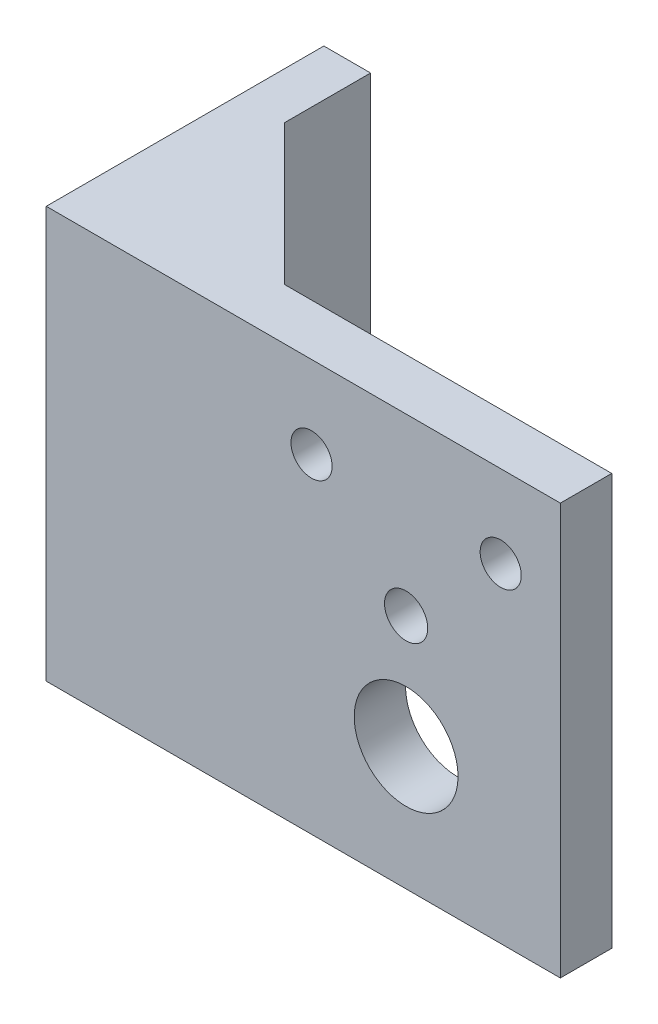
ISO-10303-21;
HEADER;
FILE_DESCRIPTION(('STEP AP214'),'2;1');
FILE_NAME('part.step','',(''),(''),'','','');
FILE_SCHEMA(('AUTOMOTIVE_DESIGN { 1 0 10303 214 1 1 1 1 }'));
ENDSEC;
DATA;
#1=APPLICATION_CONTEXT('core data for automotive mechanical design processes');
#2=APPLICATION_PROTOCOL_DEFINITION('international standard','automotive_design',2000,#1);
#3=PRODUCT_CONTEXT('',#1,'mechanical');
#4=PRODUCT('Part','Part','',(#3));
#5=PRODUCT_RELATED_PRODUCT_CATEGORY('part','',(#4));
#6=PRODUCT_DEFINITION_FORMATION('','',#4);
#7=PRODUCT_DEFINITION_CONTEXT('part definition',#1,'design');
#8=PRODUCT_DEFINITION('design','',#6,#7);
#9=PRODUCT_DEFINITION_SHAPE('','',#8);
#10=(LENGTH_UNIT() NAMED_UNIT(*) SI_UNIT(.MILLI.,.METRE.));
#11=(NAMED_UNIT(*) PLANE_ANGLE_UNIT() SI_UNIT($,.RADIAN.));
#12=(NAMED_UNIT(*) SI_UNIT($,.STERADIAN.) SOLID_ANGLE_UNIT());
#13=UNCERTAINTY_MEASURE_WITH_UNIT(LENGTH_MEASURE(1.E-05),#10,'distance_accuracy_value','');
#14=(GEOMETRIC_REPRESENTATION_CONTEXT(3) GLOBAL_UNCERTAINTY_ASSIGNED_CONTEXT((#13)) GLOBAL_UNIT_ASSIGNED_CONTEXT((#10,
#11,#12)) REPRESENTATION_CONTEXT('',''));
#15=CARTESIAN_POINT('',(0.,0.,0.));
#16=DIRECTION('',(0.,0.,1.));
#17=DIRECTION('',(1.,0.,0.));
#18=AXIS2_PLACEMENT_3D('',#15,#16,#17);
#19=CARTESIAN_POINT('',(50.,40.,-5.));
#20=DIRECTION('',(0.,0.,1.));
#21=DIRECTION('',(1.,0.,0.));
#22=AXIS2_PLACEMENT_3D('',#19,#20,#21);
#23=PLANE('',#22);
#24=CARTESIAN_POINT('',(35.,12.,-5.));
#25=DIRECTION('',(0.,0.,1.));
#26=DIRECTION('',(1.,0.,0.));
#27=AXIS2_PLACEMENT_3D('',#24,#25,#26);
#28=CIRCLE('',#27,5.05);
#29=CARTESIAN_POINT('',(40.05,12.,-5.));
#30=VERTEX_POINT('',#29);
#31=EDGE_CURVE('E220',#30,#30,#28,.T.);
#32=ORIENTED_EDGE('',*,*,#31,.T.);
#33=EDGE_LOOP('',(#32));
#34=FACE_BOUND('',#33,.T.);
#35=CARTESIAN_POINT('',(35.,23.,-5.));
#36=DIRECTION('',(0.,0.,-1.));
#37=DIRECTION('',(-1.,0.,0.));
#38=AXIS2_PLACEMENT_3D('',#35,#36,#37);
#39=CIRCLE('',#38,2.1);
#40=CARTESIAN_POINT('',(32.9,23.,-5.));
#41=VERTEX_POINT('',#40);
#42=EDGE_CURVE('E229',#41,#41,#39,.T.);
#43=ORIENTED_EDGE('',*,*,#42,.F.);
#44=EDGE_LOOP('',(#43));
#45=FACE_BOUND('',#44,.T.);
#46=CARTESIAN_POINT('',(25.8,32.,-5.));
#47=DIRECTION('',(0.,0.,-1.));
#48=DIRECTION('',(-1.,0.,0.));
#49=AXIS2_PLACEMENT_3D('',#46,#47,#48);
#50=CIRCLE('',#49,2.);
#51=CARTESIAN_POINT('',(23.8,32.,-5.));
#52=VERTEX_POINT('',#51);
#53=EDGE_CURVE('E223',#52,#52,#50,.T.);
#54=ORIENTED_EDGE('',*,*,#53,.F.);
#55=EDGE_LOOP('',(#54));
#56=FACE_BOUND('',#55,.T.);
#57=CARTESIAN_POINT('',(44.2,32.,-5.));
#58=DIRECTION('',(0.,0.,-1.));
#59=DIRECTION('',(-1.,0.,0.));
#60=AXIS2_PLACEMENT_3D('',#57,#58,#59);
#61=CIRCLE('',#60,2.);
#62=CARTESIAN_POINT('',(42.2,32.,-5.));
#63=VERTEX_POINT('',#62);
#64=EDGE_CURVE('E216',#63,#63,#61,.T.);
#65=ORIENTED_EDGE('',*,*,#64,.F.);
#66=EDGE_LOOP('',(#65));
#67=FACE_BOUND('',#66,.T.);
#68=DIRECTION('',(0.,-1.,0.));
#69=VECTOR('',#68,1.);
#70=CARTESIAN_POINT('',(20.,5.,-5.));
#71=LINE('',#70,#69);
#72=CARTESIAN_POINT('',(20.,5.,-5.));
#73=VERTEX_POINT('',#72);
#74=CARTESIAN_POINT('',(20.,0.,-5.));
#75=VERTEX_POINT('',#74);
#76=EDGE_CURVE('E58',#73,#75,#71,.T.);
#77=ORIENTED_EDGE('',*,*,#76,.F.);
#78=DIRECTION('',(1.,0.,0.));
#79=VECTOR('',#78,1.);
#80=CARTESIAN_POINT('',(4.54545454545454,5.,-5.));
#81=LINE('',#80,#79);
#82=CARTESIAN_POINT('',(4.54545454545454,5.,-5.));
#83=VERTEX_POINT('',#82);
#84=EDGE_CURVE('E189',#83,#73,#81,.T.);
#85=ORIENTED_EDGE('',*,*,#84,.F.);
#86=DIRECTION('',(0.,-1.,0.));
#87=VECTOR('',#86,1.);
#88=CARTESIAN_POINT('',(4.54545454545454,35.,-5.));
#89=LINE('',#88,#87);
#90=CARTESIAN_POINT('',(4.54545454545454,35.,-5.));
#91=VERTEX_POINT('',#90);
#92=EDGE_CURVE('E163',#91,#83,#89,.T.);
#93=ORIENTED_EDGE('',*,*,#92,.F.);
#94=DIRECTION('',(1.,0.,0.));
#95=VECTOR('',#94,1.);
#96=CARTESIAN_POINT('',(4.54545454545454,35.,-5.));
#97=LINE('',#96,#95);
#98=CARTESIAN_POINT('',(18.1818181818182,35.,-5.));
#99=VERTEX_POINT('',#98);
#100=EDGE_CURVE('E178',#91,#99,#97,.T.);
#101=ORIENTED_EDGE('',*,*,#100,.T.);
#102=DIRECTION('',(0.,-1.,0.));
#103=VECTOR('',#102,1.);
#104=CARTESIAN_POINT('',(18.1818181818182,40.,-5.));
#105=LINE('',#104,#103);
#106=CARTESIAN_POINT('',(18.1818181818182,40.,-5.));
#107=VERTEX_POINT('',#106);
#108=EDGE_CURVE('E147',#107,#99,#105,.T.);
#109=ORIENTED_EDGE('',*,*,#108,.F.);
#110=DIRECTION('',(-1.,0.,0.));
#111=VECTOR('',#110,1.);
#112=CARTESIAN_POINT('',(50.,40.,-5.));
#113=LINE('',#112,#111);
#114=CARTESIAN_POINT('',(50.,40.,-5.));
#115=VERTEX_POINT('',#114);
#116=EDGE_CURVE('E155',#115,#107,#113,.T.);
#117=ORIENTED_EDGE('',*,*,#116,.F.);
#118=DIRECTION('',(0.,-1.,0.));
#119=VECTOR('',#118,1.);
#120=CARTESIAN_POINT('',(50.,40.,-5.));
#121=LINE('',#120,#119);
#122=CARTESIAN_POINT('',(50.,0.,-5.));
#123=VERTEX_POINT('',#122);
#124=EDGE_CURVE('E43',#115,#123,#121,.T.);
#125=ORIENTED_EDGE('',*,*,#124,.T.);
#126=DIRECTION('',(-1.,0.,0.));
#127=VECTOR('',#126,1.);
#128=CARTESIAN_POINT('',(50.,0.,-5.));
#129=LINE('',#128,#127);
#130=EDGE_CURVE('E138',#123,#75,#129,.T.);
#131=ORIENTED_EDGE('',*,*,#130,.T.);
#132=EDGE_LOOP('',(#77,#85,#93,#101,#109,#117,#125,#131));
#133=FACE_BOUND('',#132,.T.);
#134=ADVANCED_FACE('F35',(#34,#45,#56,#67,#133),#23,.F.);
#135=CARTESIAN_POINT('',(4.54545454545454,40.,-18.6363636363636));
#136=DIRECTION('',(-1.,0.,0.));
#137=DIRECTION('',(0.,0.,1.));
#138=AXIS2_PLACEMENT_3D('',#135,#136,#137);
#139=PLANE('',#138);
#140=CARTESIAN_POINT('',(4.54545454545454,20.,-21.));
#141=DIRECTION('',(1.,0.,0.));
#142=DIRECTION('',(0.,0.,-1.));
#143=AXIS2_PLACEMENT_3D('',#140,#141,#142);
#144=CIRCLE('',#143,2.);
#145=CARTESIAN_POINT('',(4.54545454545454,20.,-23.));
#146=VERTEX_POINT('',#145);
#147=EDGE_CURVE('E211',#146,#146,#144,.T.);
#148=ORIENTED_EDGE('',*,*,#147,.F.);
#149=EDGE_LOOP('',(#148));
#150=FACE_BOUND('',#149,.T.);
#151=CARTESIAN_POINT('',(4.54545454545454,10.,-13.));
#152=DIRECTION('',(1.,0.,0.));
#153=DIRECTION('',(0.,0.,-1.));
#154=AXIS2_PLACEMENT_3D('',#151,#152,#153);
#155=CIRCLE('',#154,2.);
#156=CARTESIAN_POINT('',(4.54545454545454,10.,-15.));
#157=VERTEX_POINT('',#156);
#158=EDGE_CURVE('E205',#157,#157,#155,.T.);
#159=ORIENTED_EDGE('',*,*,#158,.F.);
#160=EDGE_LOOP('',(#159));
#161=FACE_BOUND('',#160,.T.);
#162=CARTESIAN_POINT('',(4.54545454545454,30.,-13.));
#163=DIRECTION('',(1.,0.,0.));
#164=DIRECTION('',(0.,0.,-1.));
#165=AXIS2_PLACEMENT_3D('',#162,#163,#164);
#166=CIRCLE('',#165,2.);
#167=CARTESIAN_POINT('',(4.54545454545454,30.,-15.));
#168=VERTEX_POINT('',#167);
#169=EDGE_CURVE('E198',#168,#168,#166,.T.);
#170=ORIENTED_EDGE('',*,*,#169,.F.);
#171=EDGE_LOOP('',(#170));
#172=FACE_BOUND('',#171,.T.);
#173=DIRECTION('',(0.,0.,-1.));
#174=VECTOR('',#173,1.);
#175=CARTESIAN_POINT('',(4.54545454545454,0.,-18.6363636363636));
#176=LINE('',#175,#174);
#177=CARTESIAN_POINT('',(4.54545454545454,0.,-20.));
#178=VERTEX_POINT('',#177);
#179=CARTESIAN_POINT('',(4.54545454545454,0.,-27.));
#180=VERTEX_POINT('',#179);
#181=EDGE_CURVE('E133',#178,#180,#176,.T.);
#182=ORIENTED_EDGE('',*,*,#181,.T.);
#183=DIRECTION('',(0.,-1.,0.));
#184=VECTOR('',#183,1.);
#185=CARTESIAN_POINT('',(4.54545454545454,40.,-27.));
#186=LINE('',#185,#184);
#187=CARTESIAN_POINT('',(4.54545454545454,40.,-27.));
#188=VERTEX_POINT('',#187);
#189=EDGE_CURVE('E113',#188,#180,#186,.T.);
#190=ORIENTED_EDGE('',*,*,#189,.F.);
#191=DIRECTION('',(0.,0.,-1.));
#192=VECTOR('',#191,1.);
#193=CARTESIAN_POINT('',(4.54545454545454,40.,-18.6363636363636));
#194=LINE('',#193,#192);
#195=CARTESIAN_POINT('',(4.54545454545454,40.,-18.6363636363636));
#196=VERTEX_POINT('',#195);
#197=EDGE_CURVE('E165',#196,#188,#194,.T.);
#198=ORIENTED_EDGE('',*,*,#197,.F.);
#199=DIRECTION('',(0.,-1.,0.));
#200=VECTOR('',#199,1.);
#201=CARTESIAN_POINT('',(4.54545454545454,40.,-18.6363636363636));
#202=LINE('',#201,#200);
#203=CARTESIAN_POINT('',(4.54545454545454,35.,-18.6363636363636));
#204=VERTEX_POINT('',#203);
#205=EDGE_CURVE('E144',#196,#204,#202,.T.);
#206=ORIENTED_EDGE('',*,*,#205,.T.);
#207=DIRECTION('',(0.,0.,1.));
#208=VECTOR('',#207,1.);
#209=CARTESIAN_POINT('',(4.54545454545454,35.,-18.6363636363636));
#210=LINE('',#209,#208);
#211=EDGE_CURVE('E180',#204,#91,#210,.T.);
#212=ORIENTED_EDGE('',*,*,#211,.T.);
#213=ORIENTED_EDGE('',*,*,#92,.T.);
#214=DIRECTION('',(0.,0.,1.));
#215=VECTOR('',#214,1.);
#216=CARTESIAN_POINT('',(4.54545454545454,5.,-20.));
#217=LINE('',#216,#215);
#218=CARTESIAN_POINT('',(4.54545454545454,5.,-20.));
#219=VERTEX_POINT('',#218);
#220=EDGE_CURVE('E187',#219,#83,#217,.T.);
#221=ORIENTED_EDGE('',*,*,#220,.F.);
#222=DIRECTION('',(0.,-1.,0.));
#223=VECTOR('',#222,1.);
#224=CARTESIAN_POINT('',(4.54545454545454,5.,-20.));
#225=LINE('',#224,#223);
#226=EDGE_CURVE('E184',#219,#178,#225,.T.);
#227=ORIENTED_EDGE('',*,*,#226,.T.);
#228=EDGE_LOOP('',(#182,#190,#198,#206,#212,#213,#221,#227));
#229=FACE_BOUND('',#228,.T.);
#230=ADVANCED_FACE('F242',(#150,#161,#172,#229),#139,.F.);
#231=CARTESIAN_POINT('',(0.,0.,0.));
#232=DIRECTION('',(0.,1.,0.));
#233=DIRECTION('',(0.,0.,1.));
#234=AXIS2_PLACEMENT_3D('',#231,#232,#233);
#235=PLANE('',#234);
#236=DIRECTION('',(0.,0.,1.));
#237=VECTOR('',#236,1.);
#238=CARTESIAN_POINT('',(0.,0.,-35.));
#239=LINE('',#238,#237);
#240=CARTESIAN_POINT('',(0.,0.,-27.));
#241=VERTEX_POINT('',#240);
#242=CARTESIAN_POINT('',(0.,0.,0.));
#243=VERTEX_POINT('',#242);
#244=EDGE_CURVE('E124',#241,#243,#239,.T.);
#245=ORIENTED_EDGE('',*,*,#244,.F.);
#246=DIRECTION('',(1.,0.,0.));
#247=VECTOR('',#246,1.);
#248=CARTESIAN_POINT('',(0.,0.,-27.));
#249=LINE('',#248,#247);
#250=EDGE_CURVE('E110',#241,#180,#249,.T.);
#251=ORIENTED_EDGE('',*,*,#250,.T.);
#252=ORIENTED_EDGE('',*,*,#181,.F.);
#253=DIRECTION('',(-0.717580691628316,0.,-0.69647537716866));
#254=VECTOR('',#253,1.);
#255=CARTESIAN_POINT('',(20.,0.,-5.));
#256=LINE('',#255,#254);
#257=EDGE_CURVE('E159',#75,#178,#256,.T.);
#258=ORIENTED_EDGE('',*,*,#257,.F.);
#259=ORIENTED_EDGE('',*,*,#130,.F.);
#260=DIRECTION('',(0.,0.,-1.));
#261=VECTOR('',#260,1.);
#262=CARTESIAN_POINT('',(50.,0.,0.));
#263=LINE('',#262,#261);
#264=CARTESIAN_POINT('',(50.,0.,0.));
#265=VERTEX_POINT('',#264);
#266=EDGE_CURVE('E157',#265,#123,#263,.T.);
#267=ORIENTED_EDGE('',*,*,#266,.F.);
#268=DIRECTION('',(1.,0.,0.));
#269=VECTOR('',#268,1.);
#270=CARTESIAN_POINT('',(0.,0.,0.));
#271=LINE('',#270,#269);
#272=EDGE_CURVE('E131',#243,#265,#271,.T.);
#273=ORIENTED_EDGE('',*,*,#272,.F.);
#274=EDGE_LOOP('',(#245,#251,#252,#258,#259,#267,#273));
#275=FACE_BOUND('',#274,.T.);
#276=ADVANCED_FACE('F129',(#275),#235,.F.);
#277=CARTESIAN_POINT('',(0.,40.,0.));
#278=DIRECTION('',(0.,0.,-1.));
#279=DIRECTION('',(-1.,0.,0.));
#280=AXIS2_PLACEMENT_3D('',#277,#278,#279);
#281=PLANE('',#280);
#282=CARTESIAN_POINT('',(35.,12.,0.));
#283=DIRECTION('',(0.,0.,1.));
#284=DIRECTION('',(1.,0.,0.));
#285=AXIS2_PLACEMENT_3D('',#282,#283,#284);
#286=CIRCLE('',#285,5.05);
#287=CARTESIAN_POINT('',(40.05,12.,0.));
#288=VERTEX_POINT('',#287);
#289=EDGE_CURVE('E117',#288,#288,#286,.T.);
#290=ORIENTED_EDGE('',*,*,#289,.F.);
#291=EDGE_LOOP('',(#290));
#292=FACE_BOUND('',#291,.T.);
#293=CARTESIAN_POINT('',(35.,23.,0.));
#294=DIRECTION('',(0.,0.,-1.));
#295=DIRECTION('',(-1.,0.,0.));
#296=AXIS2_PLACEMENT_3D('',#293,#294,#295);
#297=CIRCLE('',#296,2.1);
#298=CARTESIAN_POINT('',(32.9,23.,0.));
#299=VERTEX_POINT('',#298);
#300=EDGE_CURVE('E202',#299,#299,#297,.T.);
#301=ORIENTED_EDGE('',*,*,#300,.T.);
#302=EDGE_LOOP('',(#301));
#303=FACE_BOUND('',#302,.T.);
#304=CARTESIAN_POINT('',(25.8,32.,0.));
#305=DIRECTION('',(0.,0.,-1.));
#306=DIRECTION('',(-1.,0.,0.));
#307=AXIS2_PLACEMENT_3D('',#304,#305,#306);
#308=CIRCLE('',#307,2.);
#309=CARTESIAN_POINT('',(23.8,32.,0.));
#310=VERTEX_POINT('',#309);
#311=EDGE_CURVE('E226',#310,#310,#308,.T.);
#312=ORIENTED_EDGE('',*,*,#311,.T.);
#313=EDGE_LOOP('',(#312));
#314=FACE_BOUND('',#313,.T.);
#315=CARTESIAN_POINT('',(44.2,32.,0.));
#316=DIRECTION('',(0.,0.,-1.));
#317=DIRECTION('',(-1.,0.,0.));
#318=AXIS2_PLACEMENT_3D('',#315,#316,#317);
#319=CIRCLE('',#318,2.);
#320=CARTESIAN_POINT('',(42.2,32.,0.));
#321=VERTEX_POINT('',#320);
#322=EDGE_CURVE('E219',#321,#321,#319,.T.);
#323=ORIENTED_EDGE('',*,*,#322,.T.);
#324=EDGE_LOOP('',(#323));
#325=FACE_BOUND('',#324,.T.);
#326=ORIENTED_EDGE('',*,*,#272,.T.);
#327=DIRECTION('',(0.,-1.,0.));
#328=VECTOR('',#327,1.);
#329=CARTESIAN_POINT('',(50.,40.,0.));
#330=LINE('',#329,#328);
#331=CARTESIAN_POINT('',(50.,40.,0.));
#332=VERTEX_POINT('',#331);
#333=EDGE_CURVE('E11',#332,#265,#330,.T.);
#334=ORIENTED_EDGE('',*,*,#333,.F.);
#335=DIRECTION('',(1.,0.,0.));
#336=VECTOR('',#335,1.);
#337=CARTESIAN_POINT('',(0.,40.,0.));
#338=LINE('',#337,#336);
#339=CARTESIAN_POINT('',(0.,40.,0.));
#340=VERTEX_POINT('',#339);
#341=EDGE_CURVE('E132',#340,#332,#338,.T.);
#342=ORIENTED_EDGE('',*,*,#341,.F.);
#343=DIRECTION('',(0.,-1.,0.));
#344=VECTOR('',#343,1.);
#345=CARTESIAN_POINT('',(0.,40.,0.));
#346=LINE('',#345,#344);
#347=EDGE_CURVE('E142',#340,#243,#346,.T.);
#348=ORIENTED_EDGE('',*,*,#347,.T.);
#349=EDGE_LOOP('',(#326,#334,#342,#348));
#350=FACE_BOUND('',#349,.T.);
#351=ADVANCED_FACE('F37',(#292,#303,#314,#325,#350),#281,.F.);
#352=CARTESIAN_POINT('',(50.,40.,0.));
#353=DIRECTION('',(-1.,0.,0.));
#354=DIRECTION('',(0.,0.,1.));
#355=AXIS2_PLACEMENT_3D('',#352,#353,#354);
#356=PLANE('',#355);
#357=ORIENTED_EDGE('',*,*,#266,.T.);
#358=ORIENTED_EDGE('',*,*,#124,.F.);
#359=DIRECTION('',(0.,0.,-1.));
#360=VECTOR('',#359,1.);
#361=CARTESIAN_POINT('',(50.,40.,0.));
#362=LINE('',#361,#360);
#363=EDGE_CURVE('E136',#332,#115,#362,.T.);
#364=ORIENTED_EDGE('',*,*,#363,.F.);
#365=ORIENTED_EDGE('',*,*,#333,.T.);
#366=EDGE_LOOP('',(#357,#358,#364,#365));
#367=FACE_BOUND('',#366,.T.);
#368=ADVANCED_FACE('F275',(#367),#356,.F.);
#369=CARTESIAN_POINT('',(4.54545454545454,40.,-18.6363636363636));
#370=DIRECTION('',(0.707106781186547,0.,-0.707106781186548));
#371=DIRECTION('',(-0.707106781186548,0.,-0.707106781186547));
#372=AXIS2_PLACEMENT_3D('',#369,#370,#371);
#373=PLANE('',#372);
#374=DIRECTION('',(0.707106781186548,0.,0.707106781186547));
#375=VECTOR('',#374,1.);
#376=CARTESIAN_POINT('',(4.54545454545454,35.,-18.6363636363636));
#377=LINE('',#376,#375);
#378=EDGE_CURVE('E175',#204,#99,#377,.T.);
#379=ORIENTED_EDGE('',*,*,#378,.F.);
#380=ORIENTED_EDGE('',*,*,#205,.F.);
#381=DIRECTION('',(0.707106781186548,0.,0.707106781186547));
#382=VECTOR('',#381,1.);
#383=CARTESIAN_POINT('',(4.54545454545454,40.,-18.6363636363636));
#384=LINE('',#383,#382);
#385=EDGE_CURVE('E168',#196,#107,#384,.T.);
#386=ORIENTED_EDGE('',*,*,#385,.T.);
#387=ORIENTED_EDGE('',*,*,#108,.T.);
#388=EDGE_LOOP('',(#379,#380,#386,#387));
#389=FACE_BOUND('',#388,.T.);
#390=ADVANCED_FACE('F247',(#389),#373,.T.);
#391=CARTESIAN_POINT('',(0.,40.,-35.));
#392=DIRECTION('',(1.,0.,0.));
#393=DIRECTION('',(0.,0.,-1.));
#394=AXIS2_PLACEMENT_3D('',#391,#392,#393);
#395=PLANE('',#394);
#396=CARTESIAN_POINT('',(0.,20.,-21.));
#397=DIRECTION('',(1.,0.,0.));
#398=DIRECTION('',(0.,0.,-1.));
#399=AXIS2_PLACEMENT_3D('',#396,#397,#398);
#400=CIRCLE('',#399,2.);
#401=CARTESIAN_POINT('',(0.,20.,-23.));
#402=VERTEX_POINT('',#401);
#403=EDGE_CURVE('E190',#402,#402,#400,.T.);
#404=ORIENTED_EDGE('',*,*,#403,.T.);
#405=EDGE_LOOP('',(#404));
#406=FACE_BOUND('',#405,.T.);
#407=CARTESIAN_POINT('',(0.,10.,-13.));
#408=DIRECTION('',(1.,0.,0.));
#409=DIRECTION('',(0.,0.,-1.));
#410=AXIS2_PLACEMENT_3D('',#407,#408,#409);
#411=CIRCLE('',#410,2.);
#412=CARTESIAN_POINT('',(0.,10.,-15.));
#413=VERTEX_POINT('',#412);
#414=EDGE_CURVE('E208',#413,#413,#411,.T.);
#415=ORIENTED_EDGE('',*,*,#414,.T.);
#416=EDGE_LOOP('',(#415));
#417=FACE_BOUND('',#416,.T.);
#418=CARTESIAN_POINT('',(0.,30.,-13.));
#419=DIRECTION('',(1.,0.,0.));
#420=DIRECTION('',(0.,0.,-1.));
#421=AXIS2_PLACEMENT_3D('',#418,#419,#420);
#422=CIRCLE('',#421,2.);
#423=CARTESIAN_POINT('',(0.,30.,-15.));
#424=VERTEX_POINT('',#423);
#425=EDGE_CURVE('E201',#424,#424,#422,.T.);
#426=ORIENTED_EDGE('',*,*,#425,.T.);
#427=EDGE_LOOP('',(#426));
#428=FACE_BOUND('',#427,.T.);
#429=DIRECTION('',(0.,0.,1.));
#430=VECTOR('',#429,1.);
#431=CARTESIAN_POINT('',(0.,40.,-35.));
#432=LINE('',#431,#430);
#433=CARTESIAN_POINT('',(0.,40.,-27.));
#434=VERTEX_POINT('',#433);
#435=EDGE_CURVE('E126',#434,#340,#432,.T.);
#436=ORIENTED_EDGE('',*,*,#435,.F.);
#437=DIRECTION('',(0.,-1.,0.));
#438=VECTOR('',#437,1.);
#439=CARTESIAN_POINT('',(0.,40.,-27.));
#440=LINE('',#439,#438);
#441=EDGE_CURVE('E50',#434,#241,#440,.T.);
#442=ORIENTED_EDGE('',*,*,#441,.T.);
#443=ORIENTED_EDGE('',*,*,#244,.T.);
#444=ORIENTED_EDGE('',*,*,#347,.F.);
#445=EDGE_LOOP('',(#436,#442,#443,#444));
#446=FACE_BOUND('',#445,.T.);
#447=ADVANCED_FACE('F122',(#406,#417,#428,#446),#395,.F.);
#448=CARTESIAN_POINT('',(0.,40.,0.));
#449=DIRECTION('',(0.,1.,0.));
#450=DIRECTION('',(0.,0.,1.));
#451=AXIS2_PLACEMENT_3D('',#448,#449,#450);
#452=PLANE('',#451);
#453=DIRECTION('',(1.,0.,0.));
#454=VECTOR('',#453,1.);
#455=CARTESIAN_POINT('',(0.,40.,-27.));
#456=LINE('',#455,#454);
#457=EDGE_CURVE('E118',#434,#188,#456,.T.);
#458=ORIENTED_EDGE('',*,*,#457,.F.);
#459=ORIENTED_EDGE('',*,*,#435,.T.);
#460=ORIENTED_EDGE('',*,*,#341,.T.);
#461=ORIENTED_EDGE('',*,*,#363,.T.);
#462=ORIENTED_EDGE('',*,*,#116,.T.);
#463=ORIENTED_EDGE('',*,*,#385,.F.);
#464=ORIENTED_EDGE('',*,*,#197,.T.);
#465=EDGE_LOOP('',(#458,#459,#460,#461,#462,#463,#464));
#466=FACE_BOUND('',#465,.T.);
#467=ADVANCED_FACE('F244',(#466),#452,.T.);
#468=CARTESIAN_POINT('',(0.,35.,0.));
#469=DIRECTION('',(0.,1.,0.));
#470=DIRECTION('',(0.,0.,1.));
#471=AXIS2_PLACEMENT_3D('',#468,#469,#470);
#472=PLANE('',#471);
#473=ORIENTED_EDGE('',*,*,#211,.F.);
#474=ORIENTED_EDGE('',*,*,#378,.T.);
#475=ORIENTED_EDGE('',*,*,#100,.F.);
#476=EDGE_LOOP('',(#473,#474,#475));
#477=FACE_BOUND('',#476,.T.);
#478=ADVANCED_FACE('F256',(#477),#472,.F.);
#479=CARTESIAN_POINT('',(20.,5.,-5.));
#480=DIRECTION('',(-0.69647537716866,0.,0.717580691628316));
#481=DIRECTION('',(0.717580691628316,0.,0.69647537716866));
#482=AXIS2_PLACEMENT_3D('',#479,#480,#481);
#483=PLANE('',#482);
#484=ORIENTED_EDGE('',*,*,#257,.T.);
#485=ORIENTED_EDGE('',*,*,#226,.F.);
#486=DIRECTION('',(-0.717580691628316,0.,-0.69647537716866));
#487=VECTOR('',#486,1.);
#488=CARTESIAN_POINT('',(20.,5.,-5.));
#489=LINE('',#488,#487);
#490=EDGE_CURVE('E193',#73,#219,#489,.T.);
#491=ORIENTED_EDGE('',*,*,#490,.F.);
#492=ORIENTED_EDGE('',*,*,#76,.T.);
#493=EDGE_LOOP('',(#484,#485,#491,#492));
#494=FACE_BOUND('',#493,.T.);
#495=ADVANCED_FACE('F254',(#494),#483,.F.);
#496=CARTESIAN_POINT('',(0.,5.,0.));
#497=DIRECTION('',(0.,-1.,0.));
#498=DIRECTION('',(0.,0.,-1.));
#499=AXIS2_PLACEMENT_3D('',#496,#497,#498);
#500=PLANE('',#499);
#501=ORIENTED_EDGE('',*,*,#84,.T.);
#502=ORIENTED_EDGE('',*,*,#490,.T.);
#503=ORIENTED_EDGE('',*,*,#220,.T.);
#504=EDGE_LOOP('',(#501,#502,#503));
#505=FACE_BOUND('',#504,.T.);
#506=ADVANCED_FACE('F251',(#505),#500,.F.);
#507=CARTESIAN_POINT('',(0.,30.,-13.));
#508=DIRECTION('',(1.,0.,0.));
#509=DIRECTION('',(0.,0.,-1.));
#510=AXIS2_PLACEMENT_3D('',#507,#508,#509);
#511=CYLINDRICAL_SURFACE('',#510,2.);
#512=ORIENTED_EDGE('',*,*,#425,.F.);
#513=EDGE_LOOP('',(#512));
#514=FACE_BOUND('',#513,.T.);
#515=ORIENTED_EDGE('',*,*,#169,.T.);
#516=EDGE_LOOP('',(#515));
#517=FACE_BOUND('',#516,.T.);
#518=ADVANCED_FACE('F262',(#514,#517),#511,.F.);
#519=CARTESIAN_POINT('',(0.,10.,-13.));
#520=DIRECTION('',(1.,0.,0.));
#521=DIRECTION('',(0.,0.,-1.));
#522=AXIS2_PLACEMENT_3D('',#519,#520,#521);
#523=CYLINDRICAL_SURFACE('',#522,2.);
#524=ORIENTED_EDGE('',*,*,#414,.F.);
#525=EDGE_LOOP('',(#524));
#526=FACE_BOUND('',#525,.T.);
#527=ORIENTED_EDGE('',*,*,#158,.T.);
#528=EDGE_LOOP('',(#527));
#529=FACE_BOUND('',#528,.T.);
#530=ADVANCED_FACE('F312',(#526,#529),#523,.F.);
#531=CARTESIAN_POINT('',(0.,20.,-21.));
#532=DIRECTION('',(1.,0.,0.));
#533=DIRECTION('',(0.,0.,-1.));
#534=AXIS2_PLACEMENT_3D('',#531,#532,#533);
#535=CYLINDRICAL_SURFACE('',#534,2.);
#536=ORIENTED_EDGE('',*,*,#403,.F.);
#537=EDGE_LOOP('',(#536));
#538=FACE_BOUND('',#537,.T.);
#539=ORIENTED_EDGE('',*,*,#147,.T.);
#540=EDGE_LOOP('',(#539));
#541=FACE_BOUND('',#540,.T.);
#542=ADVANCED_FACE('F301',(#538,#541),#535,.F.);
#543=CARTESIAN_POINT('',(44.2,32.,0.));
#544=DIRECTION('',(0.,0.,-1.));
#545=DIRECTION('',(-1.,0.,0.));
#546=AXIS2_PLACEMENT_3D('',#543,#544,#545);
#547=CYLINDRICAL_SURFACE('',#546,2.);
#548=CARTESIAN_POINT('',(42.2,32.,0.));
#549=CARTESIAN_POINT('',(42.2,32.,-0.0520833333333314));
#550=CARTESIAN_POINT('',(42.2,32.,-0.104166666666665));
#551=CARTESIAN_POINT('',(42.2,32.,-0.208333333333331));
#552=CARTESIAN_POINT('',(42.2,32.,-0.260416666666665));
#553=CARTESIAN_POINT('',(42.2,32.,-0.364583333333331));
#554=CARTESIAN_POINT('',(42.2,32.,-0.416666666666665));
#555=CARTESIAN_POINT('',(42.2,32.,-0.520833333333332));
#556=CARTESIAN_POINT('',(42.2,32.,-0.572916666666665));
#557=CARTESIAN_POINT('',(42.2,32.,-0.677083333333332));
#558=CARTESIAN_POINT('',(42.2,32.,-0.729166666666665));
#559=CARTESIAN_POINT('',(42.2,32.,-0.833333333333332));
#560=CARTESIAN_POINT('',(42.2,32.,-0.885416666666665));
#561=CARTESIAN_POINT('',(42.2,32.,-0.989583333333332));
#562=CARTESIAN_POINT('',(42.2,32.,-1.04166666666667));
#563=CARTESIAN_POINT('',(42.2,32.,-1.14583333333333));
#564=CARTESIAN_POINT('',(42.2,32.,-1.19791666666666));
#565=CARTESIAN_POINT('',(42.2,32.,-1.30208333333333));
#566=CARTESIAN_POINT('',(42.2,32.,-1.35416666666667));
#567=CARTESIAN_POINT('',(42.2,32.,-1.45833333333333));
#568=CARTESIAN_POINT('',(42.2,32.,-1.51041666666667));
#569=CARTESIAN_POINT('',(42.2,32.,-1.61458333333333));
#570=CARTESIAN_POINT('',(42.2,32.,-1.66666666666667));
#571=CARTESIAN_POINT('',(42.2,32.,-1.77083333333333));
#572=CARTESIAN_POINT('',(42.2,32.,-1.82291666666667));
#573=CARTESIAN_POINT('',(42.2,32.,-1.92708333333333));
#574=CARTESIAN_POINT('',(42.2,32.,-1.97916666666667));
#575=CARTESIAN_POINT('',(42.2,32.,-2.08333333333333));
#576=CARTESIAN_POINT('',(42.2,32.,-2.13541666666667));
#577=CARTESIAN_POINT('',(42.2,32.,-2.23958333333333));
#578=CARTESIAN_POINT('',(42.2,32.,-2.29166666666667));
#579=CARTESIAN_POINT('',(42.2,32.,-2.39583333333333));
#580=CARTESIAN_POINT('',(42.2,32.,-2.44791666666667));
#581=CARTESIAN_POINT('',(42.2,32.,-2.55208333333333));
#582=CARTESIAN_POINT('',(42.2,32.,-2.60416666666667));
#583=CARTESIAN_POINT('',(42.2,32.,-2.70833333333333));
#584=CARTESIAN_POINT('',(42.2,32.,-2.76041666666667));
#585=CARTESIAN_POINT('',(42.2,32.,-2.86458333333333));
#586=CARTESIAN_POINT('',(42.2,32.,-2.91666666666667));
#587=CARTESIAN_POINT('',(42.2,32.,-3.02083333333333));
#588=CARTESIAN_POINT('',(42.2,32.,-3.07291666666667));
#589=CARTESIAN_POINT('',(42.2,32.,-3.17708333333333));
#590=CARTESIAN_POINT('',(42.2,32.,-3.22916666666667));
#591=CARTESIAN_POINT('',(42.2,32.,-3.33333333333333));
#592=CARTESIAN_POINT('',(42.2,32.,-3.38541666666667));
#593=CARTESIAN_POINT('',(42.2,32.,-3.48958333333333));
#594=CARTESIAN_POINT('',(42.2,32.,-3.54166666666667));
#595=CARTESIAN_POINT('',(42.2,32.,-3.64583333333333));
#596=CARTESIAN_POINT('',(42.2,32.,-3.69791666666667));
#597=CARTESIAN_POINT('',(42.2,32.,-3.80208333333333));
#598=CARTESIAN_POINT('',(42.2,32.,-3.85416666666667));
#599=CARTESIAN_POINT('',(42.2,32.,-3.95833333333333));
#600=CARTESIAN_POINT('',(42.2,32.,-4.01041666666667));
#601=CARTESIAN_POINT('',(42.2,32.,-4.11458333333333));
#602=CARTESIAN_POINT('',(42.2,32.,-4.16666666666667));
#603=CARTESIAN_POINT('',(42.2,32.,-4.27083333333333));
#604=CARTESIAN_POINT('',(42.2,32.,-4.32291666666667));
#605=CARTESIAN_POINT('',(42.2,32.,-4.42708333333333));
#606=CARTESIAN_POINT('',(42.2,32.,-4.47916666666667));
#607=CARTESIAN_POINT('',(42.2,32.,-4.58333333333333));
#608=CARTESIAN_POINT('',(42.2,32.,-4.63541666666667));
#609=CARTESIAN_POINT('',(42.2,32.,-4.73958333333333));
#610=CARTESIAN_POINT('',(42.2,32.,-4.79166666666667));
#611=CARTESIAN_POINT('',(42.2,32.,-4.89583333333333));
#612=CARTESIAN_POINT('',(42.2,32.,-4.94791666666667));
#613=CARTESIAN_POINT('',(42.2,32.,-5.));
#614=B_SPLINE_CURVE_WITH_KNOTS('',3,(#548,#549,#550,#551,#552,#553,#554,#555,#556,#557,#558,
#559,#560,#561,#562,#563,#564,#565,#566,#567,#568,#569,#570,#571,#572,#573,#574,#575,#576,#577,
#578,#579,#580,#581,#582,#583,#584,#585,#586,#587,#588,#589,#590,#591,#592,#593,#594,#595,#596,
#597,#598,#599,#600,#601,#602,#603,#604,#605,#606,#607,#608,#609,#610,#611,#612,#613),
.UNSPECIFIED.,.F.,.F.,(4,2,2,2,2,2,2,2,2,2,2,2,2,2,2,2,2,2,2,2,2,2,2,2,2,2,2,2,2,2,2,2,4),(0.,
0.15625,0.3125,0.46875,0.625,0.78125,0.9375,1.09375,1.25,1.40625,1.5625,1.71875,1.875,2.03125,
2.1875,2.34375,2.5,2.65625,2.8125,2.96875,3.125,3.28125,3.4375,3.59375,3.75,3.90625,4.0625,
4.21875,4.375,4.53125,4.6875,4.84375,5.),.UNSPECIFIED.);
#615=EDGE_CURVE('BSEAM297',#321,#63,#614,.T.);
#616=ORIENTED_EDGE('',*,*,#322,.F.);
#617=ORIENTED_EDGE('',*,*,#64,.T.);
#618=ORIENTED_EDGE('',*,*,#615,.T.);
#619=ORIENTED_EDGE('',*,*,#615,.F.);
#620=EDGE_LOOP('',(#616,#618,#617,#619));
#621=FACE_BOUND('',#620,.T.);
#622=ADVANCED_FACE('F297',(#621),#547,.F.);
#623=CARTESIAN_POINT('',(25.8,32.,0.));
#624=DIRECTION('',(0.,0.,-1.));
#625=DIRECTION('',(-1.,0.,0.));
#626=AXIS2_PLACEMENT_3D('',#623,#624,#625);
#627=CYLINDRICAL_SURFACE('',#626,2.);
#628=CARTESIAN_POINT('',(23.8,32.,0.));
#629=CARTESIAN_POINT('',(23.8,32.,-0.0520833333333296));
#630=CARTESIAN_POINT('',(23.8,32.,-0.104166666666663));
#631=CARTESIAN_POINT('',(23.8,32.,-0.20833333333333));
#632=CARTESIAN_POINT('',(23.8,32.,-0.260416666666663));
#633=CARTESIAN_POINT('',(23.8,32.,-0.36458333333333));
#634=CARTESIAN_POINT('',(23.8,32.,-0.416666666666663));
#635=CARTESIAN_POINT('',(23.8,32.,-0.52083333333333));
#636=CARTESIAN_POINT('',(23.8,32.,-0.572916666666663));
#637=CARTESIAN_POINT('',(23.8,32.,-0.67708333333333));
#638=CARTESIAN_POINT('',(23.8,32.,-0.729166666666663));
#639=CARTESIAN_POINT('',(23.8,32.,-0.83333333333333));
#640=CARTESIAN_POINT('',(23.8,32.,-0.885416666666663));
#641=CARTESIAN_POINT('',(23.8,32.,-0.98958333333333));
#642=CARTESIAN_POINT('',(23.8,32.,-1.04166666666666));
#643=CARTESIAN_POINT('',(23.8,32.,-1.14583333333333));
#644=CARTESIAN_POINT('',(23.8,32.,-1.19791666666666));
#645=CARTESIAN_POINT('',(23.8,32.,-1.30208333333333));
#646=CARTESIAN_POINT('',(23.8,32.,-1.35416666666666));
#647=CARTESIAN_POINT('',(23.8,32.,-1.45833333333333));
#648=CARTESIAN_POINT('',(23.8,32.,-1.51041666666666));
#649=CARTESIAN_POINT('',(23.8,32.,-1.61458333333333));
#650=CARTESIAN_POINT('',(23.8,32.,-1.66666666666666));
#651=CARTESIAN_POINT('',(23.8,32.,-1.77083333333333));
#652=CARTESIAN_POINT('',(23.8,32.,-1.82291666666666));
#653=CARTESIAN_POINT('',(23.8,32.,-1.92708333333333));
#654=CARTESIAN_POINT('',(23.8,32.,-1.97916666666666));
#655=CARTESIAN_POINT('',(23.8,32.,-2.08333333333333));
#656=CARTESIAN_POINT('',(23.8,32.,-2.13541666666666));
#657=CARTESIAN_POINT('',(23.8,32.,-2.23958333333333));
#658=CARTESIAN_POINT('',(23.8,32.,-2.29166666666666));
#659=CARTESIAN_POINT('',(23.8,32.,-2.39583333333333));
#660=CARTESIAN_POINT('',(23.8,32.,-2.44791666666666));
#661=CARTESIAN_POINT('',(23.8,32.,-2.55208333333333));
#662=CARTESIAN_POINT('',(23.8,32.,-2.60416666666666));
#663=CARTESIAN_POINT('',(23.8,32.,-2.70833333333333));
#664=CARTESIAN_POINT('',(23.8,32.,-2.76041666666666));
#665=CARTESIAN_POINT('',(23.8,32.,-2.86458333333333));
#666=CARTESIAN_POINT('',(23.8,32.,-2.91666666666666));
#667=CARTESIAN_POINT('',(23.8,32.,-3.02083333333333));
#668=CARTESIAN_POINT('',(23.8,32.,-3.07291666666666));
#669=CARTESIAN_POINT('',(23.8,32.,-3.17708333333333));
#670=CARTESIAN_POINT('',(23.8,32.,-3.22916666666666));
#671=CARTESIAN_POINT('',(23.8,32.,-3.33333333333333));
#672=CARTESIAN_POINT('',(23.8,32.,-3.38541666666666));
#673=CARTESIAN_POINT('',(23.8,32.,-3.48958333333333));
#674=CARTESIAN_POINT('',(23.8,32.,-3.54166666666666));
#675=CARTESIAN_POINT('',(23.8,32.,-3.64583333333333));
#676=CARTESIAN_POINT('',(23.8,32.,-3.69791666666666));
#677=CARTESIAN_POINT('',(23.8,32.,-3.80208333333333));
#678=CARTESIAN_POINT('',(23.8,32.,-3.85416666666666));
#679=CARTESIAN_POINT('',(23.8,32.,-3.95833333333333));
#680=CARTESIAN_POINT('',(23.8,32.,-4.01041666666666));
#681=CARTESIAN_POINT('',(23.8,32.,-4.11458333333333));
#682=CARTESIAN_POINT('',(23.8,32.,-4.16666666666666));
#683=CARTESIAN_POINT('',(23.8,32.,-4.27083333333333));
#684=CARTESIAN_POINT('',(23.8,32.,-4.32291666666666));
#685=CARTESIAN_POINT('',(23.8,32.,-4.42708333333333));
#686=CARTESIAN_POINT('',(23.8,32.,-4.47916666666666));
#687=CARTESIAN_POINT('',(23.8,32.,-4.58333333333333));
#688=CARTESIAN_POINT('',(23.8,32.,-4.63541666666666));
#689=CARTESIAN_POINT('',(23.8,32.,-4.73958333333333));
#690=CARTESIAN_POINT('',(23.8,32.,-4.79166666666666));
#691=CARTESIAN_POINT('',(23.8,32.,-4.89583333333333));
#692=CARTESIAN_POINT('',(23.8,32.,-4.94791666666666));
#693=CARTESIAN_POINT('',(23.8,32.,-5.));
#694=B_SPLINE_CURVE_WITH_KNOTS('',3,(#628,#629,#630,#631,#632,#633,#634,#635,#636,#637,#638,
#639,#640,#641,#642,#643,#644,#645,#646,#647,#648,#649,#650,#651,#652,#653,#654,#655,#656,#657,
#658,#659,#660,#661,#662,#663,#664,#665,#666,#667,#668,#669,#670,#671,#672,#673,#674,#675,#676,
#677,#678,#679,#680,#681,#682,#683,#684,#685,#686,#687,#688,#689,#690,#691,#692,#693),
.UNSPECIFIED.,.F.,.F.,(4,2,2,2,2,2,2,2,2,2,2,2,2,2,2,2,2,2,2,2,2,2,2,2,2,2,2,2,2,2,2,2,4),(0.,
0.15625,0.3125,0.46875,0.625,0.78125,0.9375,1.09375,1.25,1.40625,1.5625,1.71875,1.875,2.03125,
2.1875,2.34375,2.5,2.65625,2.8125,2.96875,3.125,3.28125,3.4375,3.59375,3.75,3.90625,4.0625,
4.21875,4.375,4.53125,4.6875,4.84375,5.),.UNSPECIFIED.);
#695=EDGE_CURVE('BSEAM300',#310,#52,#694,.T.);
#696=ORIENTED_EDGE('',*,*,#311,.F.);
#697=ORIENTED_EDGE('',*,*,#53,.T.);
#698=ORIENTED_EDGE('',*,*,#695,.T.);
#699=ORIENTED_EDGE('',*,*,#695,.F.);
#700=EDGE_LOOP('',(#696,#698,#697,#699));
#701=FACE_BOUND('',#700,.T.);
#702=ADVANCED_FACE('F300',(#701),#627,.F.);
#703=CARTESIAN_POINT('',(35.,23.,0.));
#704=DIRECTION('',(0.,0.,-1.));
#705=DIRECTION('',(-1.,0.,0.));
#706=AXIS2_PLACEMENT_3D('',#703,#704,#705);
#707=CYLINDRICAL_SURFACE('',#706,2.1);
#708=CARTESIAN_POINT('',(32.9,23.,0.));
#709=CARTESIAN_POINT('',(32.9,23.,-0.0520833333333305));
#710=CARTESIAN_POINT('',(32.9,23.,-0.104166666666664));
#711=CARTESIAN_POINT('',(32.9,23.,-0.208333333333331));
#712=CARTESIAN_POINT('',(32.9,23.,-0.260416666666664));
#713=CARTESIAN_POINT('',(32.9,23.,-0.364583333333331));
#714=CARTESIAN_POINT('',(32.9,23.,-0.416666666666664));
#715=CARTESIAN_POINT('',(32.9,23.,-0.520833333333331));
#716=CARTESIAN_POINT('',(32.9,23.,-0.572916666666664));
#717=CARTESIAN_POINT('',(32.9,23.,-0.677083333333331));
#718=CARTESIAN_POINT('',(32.9,23.,-0.729166666666664));
#719=CARTESIAN_POINT('',(32.9,23.,-0.833333333333331));
#720=CARTESIAN_POINT('',(32.9,23.,-0.885416666666664));
#721=CARTESIAN_POINT('',(32.9,23.,-0.989583333333331));
#722=CARTESIAN_POINT('',(32.9,23.,-1.04166666666666));
#723=CARTESIAN_POINT('',(32.9,23.,-1.14583333333333));
#724=CARTESIAN_POINT('',(32.9,23.,-1.19791666666666));
#725=CARTESIAN_POINT('',(32.9,23.,-1.30208333333333));
#726=CARTESIAN_POINT('',(32.9,23.,-1.35416666666666));
#727=CARTESIAN_POINT('',(32.9,23.,-1.45833333333333));
#728=CARTESIAN_POINT('',(32.9,23.,-1.51041666666666));
#729=CARTESIAN_POINT('',(32.9,23.,-1.61458333333333));
#730=CARTESIAN_POINT('',(32.9,23.,-1.66666666666666));
#731=CARTESIAN_POINT('',(32.9,23.,-1.77083333333333));
#732=CARTESIAN_POINT('',(32.9,23.,-1.82291666666666));
#733=CARTESIAN_POINT('',(32.9,23.,-1.92708333333333));
#734=CARTESIAN_POINT('',(32.9,23.,-1.97916666666666));
#735=CARTESIAN_POINT('',(32.9,23.,-2.08333333333333));
#736=CARTESIAN_POINT('',(32.9,23.,-2.13541666666666));
#737=CARTESIAN_POINT('',(32.9,23.,-2.23958333333333));
#738=CARTESIAN_POINT('',(32.9,23.,-2.29166666666666));
#739=CARTESIAN_POINT('',(32.9,23.,-2.39583333333333));
#740=CARTESIAN_POINT('',(32.9,23.,-2.44791666666666));
#741=CARTESIAN_POINT('',(32.9,23.,-2.55208333333333));
#742=CARTESIAN_POINT('',(32.9,23.,-2.60416666666666));
#743=CARTESIAN_POINT('',(32.9,23.,-2.70833333333333));
#744=CARTESIAN_POINT('',(32.9,23.,-2.76041666666666));
#745=CARTESIAN_POINT('',(32.9,23.,-2.86458333333333));
#746=CARTESIAN_POINT('',(32.9,23.,-2.91666666666667));
#747=CARTESIAN_POINT('',(32.9,23.,-3.02083333333333));
#748=CARTESIAN_POINT('',(32.9,23.,-3.07291666666667));
#749=CARTESIAN_POINT('',(32.9,23.,-3.17708333333333));
#750=CARTESIAN_POINT('',(32.9,23.,-3.22916666666666));
#751=CARTESIAN_POINT('',(32.9,23.,-3.33333333333333));
#752=CARTESIAN_POINT('',(32.9,23.,-3.38541666666667));
#753=CARTESIAN_POINT('',(32.9,23.,-3.48958333333333));
#754=CARTESIAN_POINT('',(32.9,23.,-3.54166666666667));
#755=CARTESIAN_POINT('',(32.9,23.,-3.64583333333333));
#756=CARTESIAN_POINT('',(32.9,23.,-3.69791666666667));
#757=CARTESIAN_POINT('',(32.9,23.,-3.80208333333333));
#758=CARTESIAN_POINT('',(32.9,23.,-3.85416666666666));
#759=CARTESIAN_POINT('',(32.9,23.,-3.95833333333333));
#760=CARTESIAN_POINT('',(32.9,23.,-4.01041666666666));
#761=CARTESIAN_POINT('',(32.9,23.,-4.11458333333333));
#762=CARTESIAN_POINT('',(32.9,23.,-4.16666666666667));
#763=CARTESIAN_POINT('',(32.9,23.,-4.27083333333333));
#764=CARTESIAN_POINT('',(32.9,23.,-4.32291666666667));
#765=CARTESIAN_POINT('',(32.9,23.,-4.42708333333333));
#766=CARTESIAN_POINT('',(32.9,23.,-4.47916666666667));
#767=CARTESIAN_POINT('',(32.9,23.,-4.58333333333333));
#768=CARTESIAN_POINT('',(32.9,23.,-4.63541666666667));
#769=CARTESIAN_POINT('',(32.9,23.,-4.73958333333333));
#770=CARTESIAN_POINT('',(32.9,23.,-4.79166666666667));
#771=CARTESIAN_POINT('',(32.9,23.,-4.89583333333333));
#772=CARTESIAN_POINT('',(32.9,23.,-4.94791666666667));
#773=CARTESIAN_POINT('',(32.9,23.,-5.));
#774=B_SPLINE_CURVE_WITH_KNOTS('',3,(#708,#709,#710,#711,#712,#713,#714,#715,#716,#717,#718,
#719,#720,#721,#722,#723,#724,#725,#726,#727,#728,#729,#730,#731,#732,#733,#734,#735,#736,#737,
#738,#739,#740,#741,#742,#743,#744,#745,#746,#747,#748,#749,#750,#751,#752,#753,#754,#755,#756,
#757,#758,#759,#760,#761,#762,#763,#764,#765,#766,#767,#768,#769,#770,#771,#772,#773),
.UNSPECIFIED.,.F.,.F.,(4,2,2,2,2,2,2,2,2,2,2,2,2,2,2,2,2,2,2,2,2,2,2,2,2,2,2,2,2,2,2,2,4),(0.,
0.15625,0.3125,0.46875,0.625,0.78125,0.937500000000001,1.09375,1.25,1.40625,1.5625,1.71875,
1.875,2.03125,2.1875,2.34375,2.5,2.65625,2.8125,2.96875,3.125,3.28125,3.4375,3.59375,3.75,
3.90625,4.0625,4.21875,4.375,4.53125,4.6875,4.84375,5.),.UNSPECIFIED.);
#775=EDGE_CURVE('BSEAM309',#299,#41,#774,.T.);
#776=ORIENTED_EDGE('',*,*,#300,.F.);
#777=ORIENTED_EDGE('',*,*,#42,.T.);
#778=ORIENTED_EDGE('',*,*,#775,.T.);
#779=ORIENTED_EDGE('',*,*,#775,.F.);
#780=EDGE_LOOP('',(#776,#778,#777,#779));
#781=FACE_BOUND('',#780,.T.);
#782=ADVANCED_FACE('F309',(#781),#707,.F.);
#783=CARTESIAN_POINT('',(35.,12.,-35.));
#784=DIRECTION('',(0.,0.,1.));
#785=DIRECTION('',(1.,0.,0.));
#786=AXIS2_PLACEMENT_3D('',#783,#784,#785);
#787=CYLINDRICAL_SURFACE('',#786,5.05);
#788=ORIENTED_EDGE('',*,*,#289,.T.);
#789=EDGE_LOOP('',(#788));
#790=FACE_BOUND('',#789,.T.);
#791=ORIENTED_EDGE('',*,*,#31,.F.);
#792=EDGE_LOOP('',(#791));
#793=FACE_BOUND('',#792,.T.);
#794=ADVANCED_FACE('F401',(#790,#793),#787,.F.);
#795=CARTESIAN_POINT('',(0.,40.,-27.));
#796=DIRECTION('',(0.,0.,1.));
#797=DIRECTION('',(0.,-1.,0.));
#798=AXIS2_PLACEMENT_3D('',#795,#796,#797);
#799=PLANE('',#798);
#800=ORIENTED_EDGE('',*,*,#189,.T.);
#801=ORIENTED_EDGE('',*,*,#250,.F.);
#802=ORIENTED_EDGE('',*,*,#441,.F.);
#803=ORIENTED_EDGE('',*,*,#457,.T.);
#804=EDGE_LOOP('',(#800,#801,#802,#803));
#805=FACE_BOUND('',#804,.T.);
#806=ADVANCED_FACE('F111',(#805),#799,.F.);
#807=CLOSED_SHELL('',(#134,#230,#276,#351,#368,#390,#447,#467,#478,#495,#506,#518,#530,#542,
#622,#702,#782,#794,#806));
#808=MANIFOLD_SOLID_BREP('B2',#807);
#809=ADVANCED_BREP_SHAPE_REPRESENTATION('',(#18,#808),#14);
#810=SHAPE_DEFINITION_REPRESENTATION(#9,#809);
ENDSEC;
END-ISO-10303-21;
